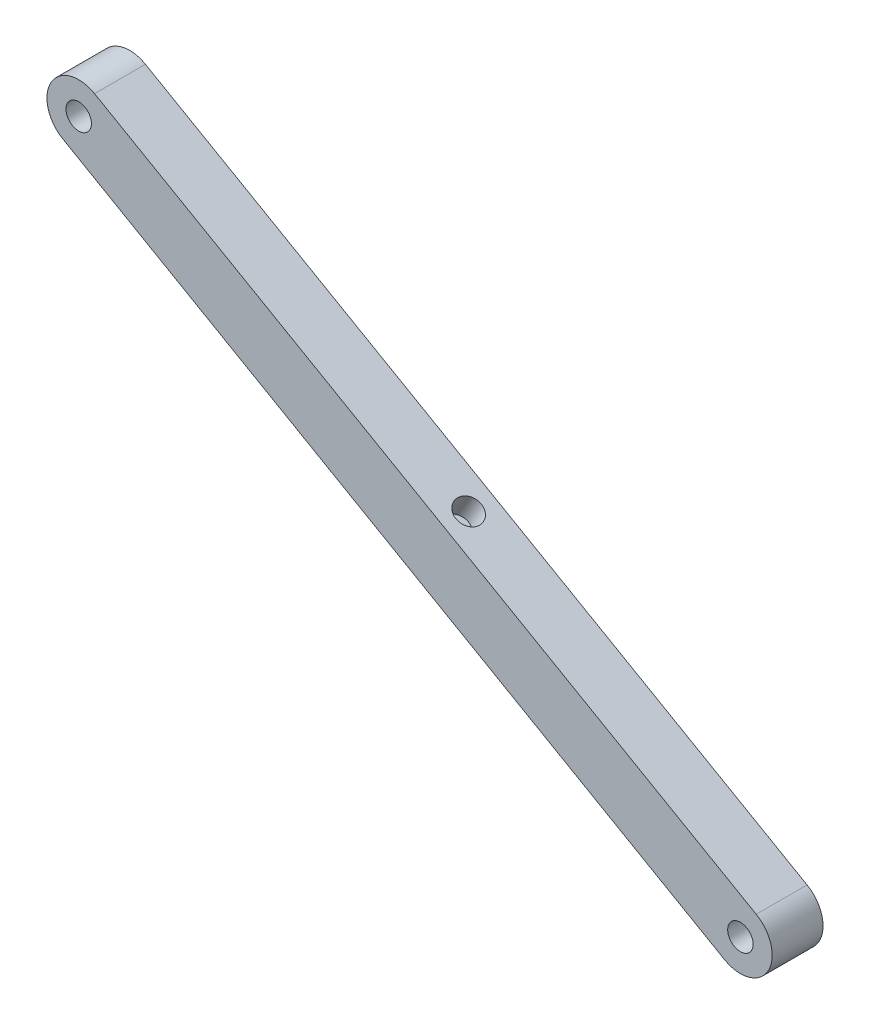
ISO-10303-21;
HEADER;
FILE_DESCRIPTION(('STEP AP214'),'2;1');
FILE_NAME('part.step','',(''),(''),'','','');
FILE_SCHEMA(('AUTOMOTIVE_DESIGN { 1 0 10303 214 1 1 1 1 }'));
ENDSEC;
DATA;
#1=APPLICATION_CONTEXT('core data for automotive mechanical design processes');
#2=APPLICATION_PROTOCOL_DEFINITION('international standard','automotive_design',2000,#1);
#3=PRODUCT_CONTEXT('',#1,'mechanical');
#4=PRODUCT('Part','Part','',(#3));
#5=PRODUCT_RELATED_PRODUCT_CATEGORY('part','',(#4));
#6=PRODUCT_DEFINITION_FORMATION('','',#4);
#7=PRODUCT_DEFINITION_CONTEXT('part definition',#1,'design');
#8=PRODUCT_DEFINITION('design','',#6,#7);
#9=PRODUCT_DEFINITION_SHAPE('','',#8);
#10=(LENGTH_UNIT() NAMED_UNIT(*) SI_UNIT(.MILLI.,.METRE.));
#11=(NAMED_UNIT(*) PLANE_ANGLE_UNIT() SI_UNIT($,.RADIAN.));
#12=(NAMED_UNIT(*) SI_UNIT($,.STERADIAN.) SOLID_ANGLE_UNIT());
#13=UNCERTAINTY_MEASURE_WITH_UNIT(LENGTH_MEASURE(1.E-05),#10,'distance_accuracy_value','');
#14=(GEOMETRIC_REPRESENTATION_CONTEXT(3) GLOBAL_UNCERTAINTY_ASSIGNED_CONTEXT((#13)) GLOBAL_UNIT_ASSIGNED_CONTEXT((#10,
#11,#12)) REPRESENTATION_CONTEXT('',''));
#15=CARTESIAN_POINT('',(0.,0.,0.));
#16=DIRECTION('',(0.,0.,1.));
#17=DIRECTION('',(1.,0.,0.));
#18=AXIS2_PLACEMENT_3D('',#15,#16,#17);
#19=CARTESIAN_POINT('',(-57.3012154382635,60.914856511146,4.));
#20=DIRECTION('',(0.,0.,1.));
#21=DIRECTION('',(1.,0.,0.));
#22=AXIS2_PLACEMENT_3D('',#19,#20,#21);
#23=PLANE('',#22);
#24=CARTESIAN_POINT('',(-57.3012154382635,60.914856511146,4.));
#25=DIRECTION('',(0.,0.,1.));
#26=DIRECTION('',(1.,0.,0.));
#27=AXIS2_PLACEMENT_3D('',#24,#25,#26);
#28=CIRCLE('',#27,0.999999999999998);
#29=CARTESIAN_POINT('',(-56.3012154382635,60.914856511146,4.));
#30=VERTEX_POINT('',#29);
#31=EDGE_CURVE('E114',#30,#30,#28,.T.);
#32=ORIENTED_EDGE('',*,*,#31,.F.);
#33=EDGE_LOOP('',(#32));
#34=FACE_BOUND('',#33,.T.);
#35=CARTESIAN_POINT('',(-57.3012154382635,60.914856511146,4.));
#36=DIRECTION('',(0.,0.,1.));
#37=DIRECTION('',(1.,0.,0.));
#38=AXIS2_PLACEMENT_3D('',#35,#36,#37);
#39=CIRCLE('',#38,2.50000000000002);
#40=CARTESIAN_POINT('',(-56.0566225948658,63.0830328541041,4.));
#41=VERTEX_POINT('',#40);
#42=CARTESIAN_POINT('',(-58.5458082816612,58.7466801681878,4.));
#43=VERTEX_POINT('',#42);
#44=EDGE_CURVE('E99',#41,#43,#39,.T.);
#45=ORIENTED_EDGE('',*,*,#44,.T.);
#46=DIRECTION('',(0.867270537183245,-0.497837137359081,0.));
#47=VECTOR('',#46,1.);
#48=CARTESIAN_POINT('',(-58.5458082816612,58.7466801681878,4.));
#49=LINE('',#48,#47);
#50=CARTESIAN_POINT('',(-6.50957605066647,28.876451926643,4.));
#51=VERTEX_POINT('',#50);
#52=EDGE_CURVE('E94',#43,#51,#49,.T.);
#53=ORIENTED_EDGE('',*,*,#52,.T.);
#54=CARTESIAN_POINT('',(-5.26498320726877,31.0446282696011,4.));
#55=DIRECTION('',(0.,0.,1.));
#56=DIRECTION('',(1.,0.,0.));
#57=AXIS2_PLACEMENT_3D('',#54,#55,#56);
#58=CIRCLE('',#57,2.5);
#59=CARTESIAN_POINT('',(-4.02039036387106,33.2128046125592,4.));
#60=VERTEX_POINT('',#59);
#61=EDGE_CURVE('E97',#51,#60,#58,.T.);
#62=ORIENTED_EDGE('',*,*,#61,.T.);
#63=DIRECTION('',(-0.867270537183245,0.497837137359082,0.));
#64=VECTOR('',#63,1.);
#65=CARTESIAN_POINT('',(-56.0566225948658,63.0830328541041,4.));
#66=LINE('',#65,#64);
#67=EDGE_CURVE('E64',#60,#41,#66,.T.);
#68=ORIENTED_EDGE('',*,*,#67,.T.);
#69=EDGE_LOOP('',(#45,#53,#62,#68));
#70=FACE_BOUND('',#69,.T.);
#71=CARTESIAN_POINT('',(-5.26498320726877,31.0446282696011,4.));
#72=DIRECTION('',(0.,0.,1.));
#73=DIRECTION('',(1.,0.,0.));
#74=AXIS2_PLACEMENT_3D('',#71,#72,#73);
#75=CIRCLE('',#74,1.);
#76=CARTESIAN_POINT('',(-4.26498320726877,31.0446282696011,4.));
#77=VERTEX_POINT('',#76);
#78=EDGE_CURVE('E129',#77,#77,#75,.T.);
#79=ORIENTED_EDGE('',*,*,#78,.F.);
#80=EDGE_LOOP('',(#79));
#81=FACE_BOUND('',#80,.T.);
#82=ADVANCED_FACE('F47',(#34,#70,#81),#23,.T.);
#83=CARTESIAN_POINT('',(-57.3012154382635,60.914856511146,0.));
#84=DIRECTION('',(0.,0.,1.));
#85=DIRECTION('',(1.,0.,0.));
#86=AXIS2_PLACEMENT_3D('',#83,#84,#85);
#87=PLANE('',#86);
#88=CARTESIAN_POINT('',(-57.3012154382635,60.914856511146,0.));
#89=DIRECTION('',(0.,0.,1.));
#90=DIRECTION('',(1.,0.,0.));
#91=AXIS2_PLACEMENT_3D('',#88,#89,#90);
#92=CIRCLE('',#91,2.50000000000002);
#93=CARTESIAN_POINT('',(-56.0566225948658,63.0830328541041,0.));
#94=VERTEX_POINT('',#93);
#95=CARTESIAN_POINT('',(-58.5458082816612,58.7466801681878,0.));
#96=VERTEX_POINT('',#95);
#97=EDGE_CURVE('E111',#94,#96,#92,.T.);
#98=ORIENTED_EDGE('',*,*,#97,.F.);
#99=DIRECTION('',(-0.867270537183245,0.497837137359082,0.));
#100=VECTOR('',#99,1.);
#101=CARTESIAN_POINT('',(-56.0566225948658,63.0830328541041,0.));
#102=LINE('',#101,#100);
#103=CARTESIAN_POINT('',(-4.02039036387106,33.2128046125592,0.));
#104=VERTEX_POINT('',#103);
#105=EDGE_CURVE('E87',#104,#94,#102,.T.);
#106=ORIENTED_EDGE('',*,*,#105,.F.);
#107=CARTESIAN_POINT('',(-5.26498320726877,31.0446282696011,0.));
#108=DIRECTION('',(0.,0.,1.));
#109=DIRECTION('',(1.,0.,0.));
#110=AXIS2_PLACEMENT_3D('',#107,#108,#109);
#111=CIRCLE('',#110,2.5);
#112=CARTESIAN_POINT('',(-6.50957605066647,28.876451926643,0.));
#113=VERTEX_POINT('',#112);
#114=EDGE_CURVE('E81',#113,#104,#111,.T.);
#115=ORIENTED_EDGE('',*,*,#114,.F.);
#116=DIRECTION('',(0.867270537183245,-0.497837137359081,0.));
#117=VECTOR('',#116,1.);
#118=CARTESIAN_POINT('',(-58.5458082816612,58.7466801681878,0.));
#119=LINE('',#118,#117);
#120=EDGE_CURVE('E103',#96,#113,#119,.T.);
#121=ORIENTED_EDGE('',*,*,#120,.F.);
#122=EDGE_LOOP('',(#98,#106,#115,#121));
#123=FACE_BOUND('',#122,.T.);
#124=CARTESIAN_POINT('',(-57.3012154382635,60.914856511146,0.));
#125=DIRECTION('',(0.,0.,1.));
#126=DIRECTION('',(1.,0.,0.));
#127=AXIS2_PLACEMENT_3D('',#124,#125,#126);
#128=CIRCLE('',#127,0.999999999999998);
#129=CARTESIAN_POINT('',(-56.3012154382635,60.914856511146,0.));
#130=VERTEX_POINT('',#129);
#131=EDGE_CURVE('E126',#130,#130,#128,.T.);
#132=ORIENTED_EDGE('',*,*,#131,.T.);
#133=EDGE_LOOP('',(#132));
#134=FACE_BOUND('',#133,.T.);
#135=CARTESIAN_POINT('',(-5.26498320726877,31.0446282696011,0.));
#136=DIRECTION('',(0.,0.,1.));
#137=DIRECTION('',(1.,0.,0.));
#138=AXIS2_PLACEMENT_3D('',#135,#136,#137);
#139=CIRCLE('',#138,1.);
#140=CARTESIAN_POINT('',(-4.26498320726877,31.0446282696011,0.));
#141=VERTEX_POINT('',#140);
#142=EDGE_CURVE('E132',#141,#141,#139,.T.);
#143=ORIENTED_EDGE('',*,*,#142,.T.);
#144=EDGE_LOOP('',(#143));
#145=FACE_BOUND('',#144,.T.);
#146=ADVANCED_FACE('F122',(#123,#134,#145),#87,.F.);
#147=CARTESIAN_POINT('',(-57.3012154382635,60.914856511146,4.));
#148=DIRECTION('',(0.,0.,-1.));
#149=DIRECTION('',(-1.,0.,0.));
#150=AXIS2_PLACEMENT_3D('',#147,#148,#149);
#151=CYLINDRICAL_SURFACE('',#150,2.50000000000002);
#152=ORIENTED_EDGE('',*,*,#97,.T.);
#153=DIRECTION('',(0.,0.,-1.));
#154=VECTOR('',#153,1.);
#155=CARTESIAN_POINT('',(-58.5458082816612,58.7466801681878,4.));
#156=LINE('',#155,#154);
#157=EDGE_CURVE('E13',#43,#96,#156,.T.);
#158=ORIENTED_EDGE('',*,*,#157,.F.);
#159=ORIENTED_EDGE('',*,*,#44,.F.);
#160=DIRECTION('',(0.,0.,-1.));
#161=VECTOR('',#160,1.);
#162=CARTESIAN_POINT('',(-56.0566225948658,63.0830328541041,4.));
#163=LINE('',#162,#161);
#164=EDGE_CURVE('E107',#41,#94,#163,.T.);
#165=ORIENTED_EDGE('',*,*,#164,.T.);
#166=EDGE_LOOP('',(#152,#158,#159,#165));
#167=FACE_BOUND('',#166,.T.);
#168=ADVANCED_FACE('F49',(#167),#151,.T.);
#169=CARTESIAN_POINT('',(-58.5458082816612,58.7466801681878,4.));
#170=DIRECTION('',(0.497837137359081,0.867270537183245,0.));
#171=DIRECTION('',(-0.867270537183246,0.497837137359081,0.));
#172=AXIS2_PLACEMENT_3D('',#169,#170,#171);
#173=PLANE('',#172);
#174=ORIENTED_EDGE('',*,*,#120,.T.);
#175=DIRECTION('',(0.,0.,-1.));
#176=VECTOR('',#175,1.);
#177=CARTESIAN_POINT('',(-6.50957605066647,28.876451926643,4.));
#178=LINE('',#177,#176);
#179=EDGE_CURVE('E56',#51,#113,#178,.T.);
#180=ORIENTED_EDGE('',*,*,#179,.F.);
#181=ORIENTED_EDGE('',*,*,#52,.F.);
#182=ORIENTED_EDGE('',*,*,#157,.T.);
#183=EDGE_LOOP('',(#174,#180,#181,#182));
#184=FACE_BOUND('',#183,.T.);
#185=ADVANCED_FACE('F102',(#184),#173,.F.);
#186=CARTESIAN_POINT('',(-5.26498320726877,31.0446282696011,4.));
#187=DIRECTION('',(0.,0.,-1.));
#188=DIRECTION('',(-1.,0.,0.));
#189=AXIS2_PLACEMENT_3D('',#186,#187,#188);
#190=CYLINDRICAL_SURFACE('',#189,2.5);
#191=ORIENTED_EDGE('',*,*,#114,.T.);
#192=DIRECTION('',(0.,0.,-1.));
#193=VECTOR('',#192,1.);
#194=CARTESIAN_POINT('',(-4.02039036387106,33.2128046125592,4.));
#195=LINE('',#194,#193);
#196=EDGE_CURVE('E104',#60,#104,#195,.T.);
#197=ORIENTED_EDGE('',*,*,#196,.F.);
#198=ORIENTED_EDGE('',*,*,#61,.F.);
#199=ORIENTED_EDGE('',*,*,#179,.T.);
#200=EDGE_LOOP('',(#191,#197,#198,#199));
#201=FACE_BOUND('',#200,.T.);
#202=ADVANCED_FACE('F105',(#201),#190,.T.);
#203=CARTESIAN_POINT('',(-56.0566225948658,63.0830328541041,4.));
#204=DIRECTION('',(-0.497837137359082,-0.867270537183245,0.));
#205=DIRECTION('',(0.867270537183245,-0.497837137359082,0.));
#206=AXIS2_PLACEMENT_3D('',#203,#204,#205);
#207=PLANE('',#206);
#208=CARTESIAN_POINT('',(-28.635584917886,47.3426031781923,2.));
#209=DIRECTION('',(0.497837137359081,0.867270537183246,0.));
#210=DIRECTION('',(-0.867270537183246,0.497837137359081,0.));
#211=AXIS2_PLACEMENT_3D('',#208,#209,#210);
#212=CIRCLE('',#211,0.999999999999992);
#213=CARTESIAN_POINT('',(-29.5028554550693,47.8404403155513,2.));
#214=VERTEX_POINT('',#213);
#215=EDGE_CURVE('E138',#214,#214,#212,.T.);
#216=ORIENTED_EDGE('',*,*,#215,.F.);
#217=EDGE_LOOP('',(#216));
#218=FACE_BOUND('',#217,.T.);
#219=ORIENTED_EDGE('',*,*,#105,.T.);
#220=ORIENTED_EDGE('',*,*,#164,.F.);
#221=ORIENTED_EDGE('',*,*,#67,.F.);
#222=ORIENTED_EDGE('',*,*,#196,.T.);
#223=EDGE_LOOP('',(#219,#220,#221,#222));
#224=FACE_BOUND('',#223,.T.);
#225=ADVANCED_FACE('F119',(#218,#224),#207,.F.);
#226=CARTESIAN_POINT('',(-57.3012154382635,60.914856511146,4.));
#227=DIRECTION('',(0.,0.,-1.));
#228=DIRECTION('',(-1.,0.,0.));
#229=AXIS2_PLACEMENT_3D('',#226,#227,#228);
#230=CYLINDRICAL_SURFACE('',#229,0.999999999999998);
#231=ORIENTED_EDGE('',*,*,#31,.T.);
#232=EDGE_LOOP('',(#231));
#233=FACE_BOUND('',#232,.T.);
#234=ORIENTED_EDGE('',*,*,#131,.F.);
#235=EDGE_LOOP('',(#234));
#236=FACE_BOUND('',#235,.T.);
#237=ADVANCED_FACE('F154',(#233,#236),#230,.F.);
#238=CARTESIAN_POINT('',(-5.26498320726877,31.0446282696011,4.));
#239=DIRECTION('',(0.,0.,-1.));
#240=DIRECTION('',(-1.,0.,0.));
#241=AXIS2_PLACEMENT_3D('',#238,#239,#240);
#242=CYLINDRICAL_SURFACE('',#241,1.);
#243=ORIENTED_EDGE('',*,*,#78,.T.);
#244=EDGE_LOOP('',(#243));
#245=FACE_BOUND('',#244,.T.);
#246=ORIENTED_EDGE('',*,*,#142,.F.);
#247=EDGE_LOOP('',(#246));
#248=FACE_BOUND('',#247,.T.);
#249=ADVANCED_FACE('F149',(#245,#248),#242,.F.);
#250=CARTESIAN_POINT('',(-29.6312591926042,45.6080621038258,2.));
#251=DIRECTION('',(0.497837137359081,0.867270537183246,0.));
#252=DIRECTION('',(-0.867270537183246,0.497837137359081,0.));
#253=AXIS2_PLACEMENT_3D('',#250,#251,#252);
#254=CYLINDRICAL_SURFACE('',#253,0.999999999999992);
#255=CARTESIAN_POINT('',(-29.6312591926042,45.6080621038258,2.));
#256=DIRECTION('',(0.497837137359081,0.867270537183246,0.));
#257=DIRECTION('',(-0.867270537183246,0.497837137359081,0.));
#258=AXIS2_PLACEMENT_3D('',#255,#256,#257);
#259=CIRCLE('',#258,0.999999999999992);
#260=CARTESIAN_POINT('',(-30.4985297297874,46.1058992411849,2.));
#261=VERTEX_POINT('',#260);
#262=EDGE_CURVE('E135',#261,#261,#259,.T.);
#263=ORIENTED_EDGE('',*,*,#262,.F.);
#264=EDGE_LOOP('',(#263));
#265=FACE_BOUND('',#264,.T.);
#266=ORIENTED_EDGE('',*,*,#215,.T.);
#267=EDGE_LOOP('',(#266));
#268=FACE_BOUND('',#267,.T.);
#269=ADVANCED_FACE('F146',(#265,#268),#254,.F.);
#270=CARTESIAN_POINT('',(-29.6312591926042,45.6080621038258,2.));
#271=DIRECTION('',(0.497837137359081,0.867270537183246,0.));
#272=DIRECTION('',(-0.867270537183246,0.497837137359081,0.));
#273=AXIS2_PLACEMENT_3D('',#270,#271,#272);
#274=PLANE('',#273);
#275=ORIENTED_EDGE('',*,*,#262,.T.);
#276=EDGE_LOOP('',(#275));
#277=FACE_BOUND('',#276,.T.);
#278=ADVANCED_FACE('F144',(#277),#274,.T.);
#279=CLOSED_SHELL('',(#82,#146,#168,#185,#202,#225,#237,#249,#269,#278));
#280=MANIFOLD_SOLID_BREP('B2',#279);
#281=ADVANCED_BREP_SHAPE_REPRESENTATION('',(#18,#280),#14);
#282=SHAPE_DEFINITION_REPRESENTATION(#9,#281);
ENDSEC;
END-ISO-10303-21;
